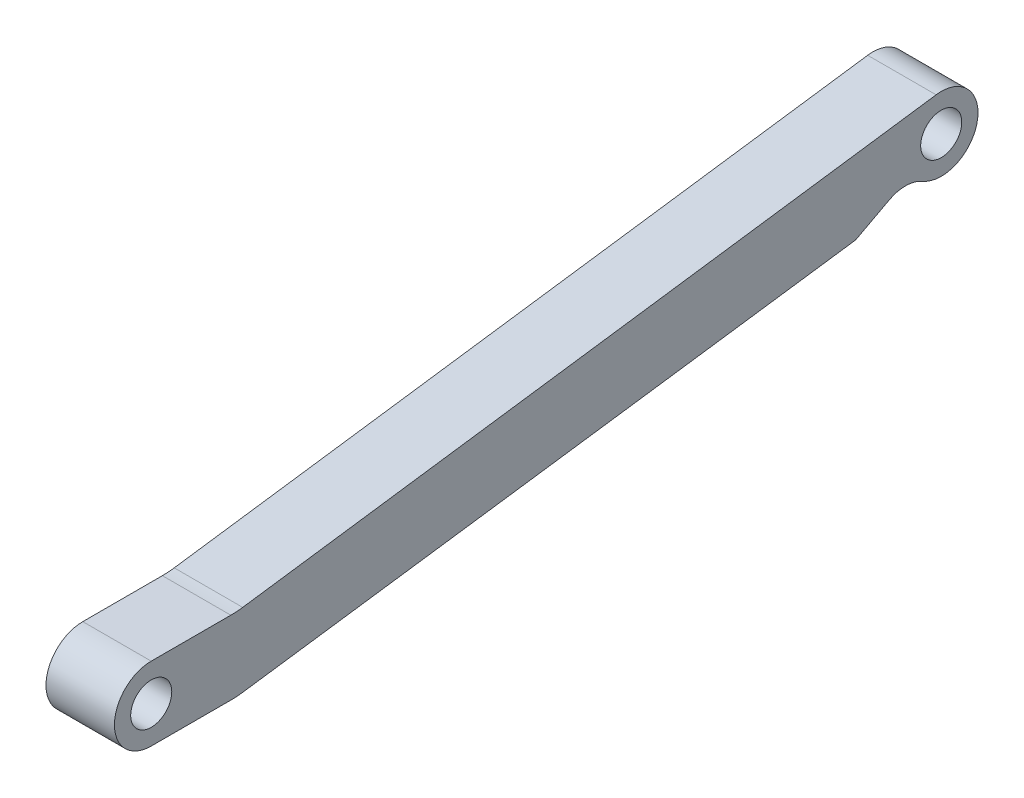
ISO-10303-21;
HEADER;
FILE_DESCRIPTION(('STEP AP214'),'2;1');
FILE_NAME('part.step','',(''),(''),'','','');
FILE_SCHEMA(('AUTOMOTIVE_DESIGN { 1 0 10303 214 1 1 1 1 }'));
ENDSEC;
DATA;
#1=APPLICATION_CONTEXT('core data for automotive mechanical design processes');
#2=APPLICATION_PROTOCOL_DEFINITION('international standard','automotive_design',2000,#1);
#3=PRODUCT_CONTEXT('',#1,'mechanical');
#4=PRODUCT('Part','Part','',(#3));
#5=PRODUCT_RELATED_PRODUCT_CATEGORY('part','',(#4));
#6=PRODUCT_DEFINITION_FORMATION('','',#4);
#7=PRODUCT_DEFINITION_CONTEXT('part definition',#1,'design');
#8=PRODUCT_DEFINITION('design','',#6,#7);
#9=PRODUCT_DEFINITION_SHAPE('','',#8);
#10=(LENGTH_UNIT() NAMED_UNIT(*) SI_UNIT(.MILLI.,.METRE.));
#11=(NAMED_UNIT(*) PLANE_ANGLE_UNIT() SI_UNIT($,.RADIAN.));
#12=(NAMED_UNIT(*) SI_UNIT($,.STERADIAN.) SOLID_ANGLE_UNIT());
#13=UNCERTAINTY_MEASURE_WITH_UNIT(LENGTH_MEASURE(1.E-05),#10,'distance_accuracy_value','');
#14=(GEOMETRIC_REPRESENTATION_CONTEXT(3) GLOBAL_UNCERTAINTY_ASSIGNED_CONTEXT((#13)) GLOBAL_UNIT_ASSIGNED_CONTEXT((#10,
#11,#12)) REPRESENTATION_CONTEXT('',''));
#15=CARTESIAN_POINT('',(0.,0.,0.));
#16=DIRECTION('',(0.,0.,1.));
#17=DIRECTION('',(1.,0.,0.));
#18=AXIS2_PLACEMENT_3D('',#15,#16,#17);
#19=CARTESIAN_POINT('',(-2.,-1.83661344340443,-44.0829449044658));
#20=DIRECTION('',(1.,0.,0.));
#21=DIRECTION('',(0.,0.,-1.));
#22=AXIS2_PLACEMENT_3D('',#19,#20,#21);
#23=CYLINDRICAL_SURFACE('',#22,2.);
#24=DIRECTION('',(1.,0.,0.));
#25=VECTOR('',#24,1.);
#26=CARTESIAN_POINT('',(-2.,-0.108125036944463,-45.0890899381133));
#27=LINE('',#26,#25);
#28=CARTESIAN_POINT('',(-2.,-0.108125036944463,-45.0890899381133));
#29=VERTEX_POINT('',#28);
#30=CARTESIAN_POINT('',(2.,-0.108125036944463,-45.0890899381133));
#31=VERTEX_POINT('',#30);
#32=EDGE_CURVE('E42',#29,#31,#27,.T.);
#33=ORIENTED_EDGE('',*,*,#32,.T.);
#34=CARTESIAN_POINT('',(2.,-1.83661344340443,-44.0829449044658));
#35=DIRECTION('',(1.,0.,0.));
#36=DIRECTION('',(0.,0.,-1.));
#37=AXIS2_PLACEMENT_3D('',#34,#35,#36);
#38=CIRCLE('',#37,2.);
#39=CARTESIAN_POINT('',(2.,-0.0694475118650471,-43.1463956156366));
#40=VERTEX_POINT('',#39);
#41=EDGE_CURVE('E119',#31,#40,#38,.T.);
#42=ORIENTED_EDGE('',*,*,#41,.T.);
#43=DIRECTION('',(1.,0.,0.));
#44=VECTOR('',#43,1.);
#45=CARTESIAN_POINT('',(-2.,-0.0694475118650471,-43.1463956156366));
#46=LINE('',#45,#44);
#47=CARTESIAN_POINT('',(-2.,-0.0694475118650471,-43.1463956156366));
#48=VERTEX_POINT('',#47);
#49=EDGE_CURVE('E11',#48,#40,#46,.T.);
#50=ORIENTED_EDGE('',*,*,#49,.F.);
#51=CARTESIAN_POINT('',(-2.,-1.83661344340443,-44.0829449044658));
#52=DIRECTION('',(1.,0.,0.));
#53=DIRECTION('',(0.,0.,-1.));
#54=AXIS2_PLACEMENT_3D('',#51,#52,#53);
#55=CIRCLE('',#54,2.);
#56=EDGE_CURVE('E55',#29,#48,#55,.T.);
#57=ORIENTED_EDGE('',*,*,#56,.F.);
#58=EDGE_LOOP('',(#33,#42,#50,#57));
#59=FACE_BOUND('',#58,.T.);
#60=ADVANCED_FACE('F39',(#59),#23,.F.);
#61=CARTESIAN_POINT('',(-2.,-17.906450020294,-9.4899254974624));
#62=DIRECTION('',(0.,-0.883582965769693,-0.468274644414615));
#63=DIRECTION('',(0.,0.468274644414615,-0.883582965769693));
#64=AXIS2_PLACEMENT_3D('',#61,#62,#63);
#65=PLANE('',#64);
#66=ORIENTED_EDGE('',*,*,#49,.T.);
#67=DIRECTION('',(0.,0.468274644414615,-0.883582965769693));
#68=VECTOR('',#67,1.);
#69=CARTESIAN_POINT('',(2.,-17.906450020294,-9.4899254974624));
#70=LINE('',#69,#68);
#71=CARTESIAN_POINT('',(2.,-1.11651399164119,-41.1706958492843));
#72=VERTEX_POINT('',#71);
#73=EDGE_CURVE('E137',#72,#40,#70,.T.);
#74=ORIENTED_EDGE('',*,*,#73,.F.);
#75=DIRECTION('',(1.,0.,0.));
#76=VECTOR('',#75,1.);
#77=CARTESIAN_POINT('',(-2.,-1.11651399164119,-41.1706958492843));
#78=LINE('',#77,#76);
#79=CARTESIAN_POINT('',(-2.,-1.11651399164119,-41.1706958492843));
#80=VERTEX_POINT('',#79);
#81=EDGE_CURVE('E47',#80,#72,#78,.T.);
#82=ORIENTED_EDGE('',*,*,#81,.F.);
#83=DIRECTION('',(0.,0.468274644414615,-0.883582965769693));
#84=VECTOR('',#83,1.);
#85=CARTESIAN_POINT('',(-2.,-17.906450020294,-9.4899254974624));
#86=LINE('',#85,#84);
#87=EDGE_CURVE('E185',#80,#48,#86,.T.);
#88=ORIENTED_EDGE('',*,*,#87,.T.);
#89=EDGE_LOOP('',(#66,#74,#82,#88));
#90=FACE_BOUND('',#89,.T.);
#91=ADVANCED_FACE('F234',(#90),#65,.T.);
#92=CARTESIAN_POINT('',(-2.,-6.71574379994448,-0.934557703661422));
#93=DIRECTION('',(0.,-0.990455753784372,-0.137831055264886));
#94=DIRECTION('',(0.,0.137831055264886,-0.990455753784372));
#95=AXIS2_PLACEMENT_3D('',#92,#93,#94);
#96=PLANE('',#95);
#97=ORIENTED_EDGE('',*,*,#81,.T.);
#98=DIRECTION('',(0.,0.137831055264886,-0.990455753784372));
#99=VECTOR('',#98,1.);
#100=CARTESIAN_POINT('',(2.,-6.71574379994448,-0.934557703661422));
#101=LINE('',#100,#99);
#102=CARTESIAN_POINT('',(2.,-6.10227876892186,-5.34292538650434));
#103=VERTEX_POINT('',#102);
#104=EDGE_CURVE('E156',#103,#72,#101,.T.);
#105=ORIENTED_EDGE('',*,*,#104,.F.);
#106=DIRECTION('',(1.,0.,0.));
#107=VECTOR('',#106,1.);
#108=CARTESIAN_POINT('',(-2.,-6.10227876892186,-5.34292538650434));
#109=LINE('',#108,#107);
#110=CARTESIAN_POINT('',(-2.,-6.10227876892186,-5.34292538650434));
#111=VERTEX_POINT('',#110);
#112=EDGE_CURVE('E193',#111,#103,#109,.T.);
#113=ORIENTED_EDGE('',*,*,#112,.F.);
#114=DIRECTION('',(0.,0.137831055264886,-0.990455753784372));
#115=VECTOR('',#114,1.);
#116=CARTESIAN_POINT('',(-2.,-6.71574379994448,-0.934557703661422));
#117=LINE('',#116,#115);
#118=EDGE_CURVE('E183',#111,#80,#117,.T.);
#119=ORIENTED_EDGE('',*,*,#118,.T.);
#120=EDGE_LOOP('',(#97,#105,#113,#119));
#121=FACE_BOUND('',#120,.T.);
#122=ADVANCED_FACE('F232',(#121),#96,.T.);
#123=CARTESIAN_POINT('',(-2.,-1.15,-4.6537701101799));
#124=DIRECTION('',(1.,0.,0.));
#125=DIRECTION('',(0.,0.,-1.));
#126=AXIS2_PLACEMENT_3D('',#123,#124,#125);
#127=CYLINDRICAL_SURFACE('',#126,5.);
#128=ORIENTED_EDGE('',*,*,#112,.T.);
#129=CARTESIAN_POINT('',(2.,-1.15,-4.6537701101799));
#130=DIRECTION('',(1.,0.,0.));
#131=DIRECTION('',(0.,0.,-1.));
#132=AXIS2_PLACEMENT_3D('',#129,#130,#131);
#133=CIRCLE('',#132,5.);
#134=CARTESIAN_POINT('',(2.,-6.15,-4.6537701101799));
#135=VERTEX_POINT('',#134);
#136=EDGE_CURVE('E153',#135,#103,#133,.T.);
#137=ORIENTED_EDGE('',*,*,#136,.F.);
#138=DIRECTION('',(1.,0.,0.));
#139=VECTOR('',#138,1.);
#140=CARTESIAN_POINT('',(-2.,-6.15,-4.6537701101799));
#141=LINE('',#140,#139);
#142=CARTESIAN_POINT('',(-2.,-6.15,-4.6537701101799));
#143=VERTEX_POINT('',#142);
#144=EDGE_CURVE('E195',#143,#135,#141,.T.);
#145=ORIENTED_EDGE('',*,*,#144,.F.);
#146=CARTESIAN_POINT('',(-2.,-1.15,-4.6537701101799));
#147=DIRECTION('',(1.,0.,0.));
#148=DIRECTION('',(0.,0.,-1.));
#149=AXIS2_PLACEMENT_3D('',#146,#147,#148);
#150=CIRCLE('',#149,5.);
#151=EDGE_CURVE('E180',#143,#111,#150,.T.);
#152=ORIENTED_EDGE('',*,*,#151,.T.);
#153=EDGE_LOOP('',(#128,#137,#145,#152));
#154=FACE_BOUND('',#153,.T.);
#155=ADVANCED_FACE('F227',(#154),#127,.T.);
#156=CARTESIAN_POINT('',(-2.,-6.15,0.));
#157=DIRECTION('',(0.,-1.,0.));
#158=DIRECTION('',(0.,0.,-1.));
#159=AXIS2_PLACEMENT_3D('',#156,#157,#158);
#160=PLANE('',#159);
#161=ORIENTED_EDGE('',*,*,#144,.T.);
#162=DIRECTION('',(0.,0.,-1.));
#163=VECTOR('',#162,1.);
#164=CARTESIAN_POINT('',(2.,-6.15,0.));
#165=LINE('',#164,#163);
#166=CARTESIAN_POINT('',(2.,-6.15,0.));
#167=VERTEX_POINT('',#166);
#168=EDGE_CURVE('E150',#167,#135,#165,.T.);
#169=ORIENTED_EDGE('',*,*,#168,.F.);
#170=DIRECTION('',(1.,0.,0.));
#171=VECTOR('',#170,1.);
#172=CARTESIAN_POINT('',(-2.,-6.15,0.));
#173=LINE('',#172,#171);
#174=CARTESIAN_POINT('',(-2.,-6.15,0.));
#175=VERTEX_POINT('',#174);
#176=EDGE_CURVE('E197',#175,#167,#173,.T.);
#177=ORIENTED_EDGE('',*,*,#176,.F.);
#178=DIRECTION('',(0.,0.,-1.));
#179=VECTOR('',#178,1.);
#180=CARTESIAN_POINT('',(-2.,-6.15,0.));
#181=LINE('',#180,#179);
#182=EDGE_CURVE('E177',#175,#143,#181,.T.);
#183=ORIENTED_EDGE('',*,*,#182,.T.);
#184=EDGE_LOOP('',(#161,#169,#177,#183));
#185=FACE_BOUND('',#184,.T.);
#186=ADVANCED_FACE('F223',(#185),#160,.T.);
#187=CARTESIAN_POINT('',(-2.,-4.,0.));
#188=DIRECTION('',(1.,0.,0.));
#189=DIRECTION('',(0.,0.,-1.));
#190=AXIS2_PLACEMENT_3D('',#187,#188,#189);
#191=CYLINDRICAL_SURFACE('',#190,2.15);
#192=ORIENTED_EDGE('',*,*,#176,.T.);
#193=CARTESIAN_POINT('',(2.,-4.,0.));
#194=DIRECTION('',(1.,0.,0.));
#195=DIRECTION('',(0.,0.,-1.));
#196=AXIS2_PLACEMENT_3D('',#193,#194,#195);
#197=CIRCLE('',#196,2.15);
#198=CARTESIAN_POINT('',(2.,-1.85,0.));
#199=VERTEX_POINT('',#198);
#200=EDGE_CURVE('E147',#199,#167,#197,.T.);
#201=ORIENTED_EDGE('',*,*,#200,.F.);
#202=DIRECTION('',(1.,0.,0.));
#203=VECTOR('',#202,1.);
#204=CARTESIAN_POINT('',(-2.,-1.85,0.));
#205=LINE('',#204,#203);
#206=CARTESIAN_POINT('',(-2.,-1.85,0.));
#207=VERTEX_POINT('',#206);
#208=EDGE_CURVE('E199',#207,#199,#205,.T.);
#209=ORIENTED_EDGE('',*,*,#208,.F.);
#210=CARTESIAN_POINT('',(-2.,-4.,0.));
#211=DIRECTION('',(1.,0.,0.));
#212=DIRECTION('',(0.,0.,-1.));
#213=AXIS2_PLACEMENT_3D('',#210,#211,#212);
#214=CIRCLE('',#213,2.15);
#215=EDGE_CURVE('E174',#207,#175,#214,.T.);
#216=ORIENTED_EDGE('',*,*,#215,.T.);
#217=EDGE_LOOP('',(#192,#201,#209,#216));
#218=FACE_BOUND('',#217,.T.);
#219=ADVANCED_FACE('F250',(#218),#191,.T.);
#220=CARTESIAN_POINT('',(-2.,-1.85,0.));
#221=DIRECTION('',(0.,-1.,0.));
#222=DIRECTION('',(0.,0.,-1.));
#223=AXIS2_PLACEMENT_3D('',#220,#221,#222);
#224=PLANE('',#223);
#225=ORIENTED_EDGE('',*,*,#208,.T.);
#226=DIRECTION('',(0.,0.,-1.));
#227=VECTOR('',#226,1.);
#228=CARTESIAN_POINT('',(2.,-1.85,0.));
#229=LINE('',#228,#227);
#230=CARTESIAN_POINT('',(2.,-1.85,-4.65127219501765));
#231=VERTEX_POINT('',#230);
#232=EDGE_CURVE('E144',#199,#231,#229,.T.);
#233=ORIENTED_EDGE('',*,*,#232,.T.);
#234=DIRECTION('',(1.,0.,0.));
#235=VECTOR('',#234,1.);
#236=CARTESIAN_POINT('',(-2.,-1.85,-4.65127219501765));
#237=LINE('',#236,#235);
#238=CARTESIAN_POINT('',(-2.,-1.85,-4.65127219501765));
#239=VERTEX_POINT('',#238);
#240=EDGE_CURVE('E201',#239,#231,#237,.T.);
#241=ORIENTED_EDGE('',*,*,#240,.F.);
#242=DIRECTION('',(0.,0.,-1.));
#243=VECTOR('',#242,1.);
#244=CARTESIAN_POINT('',(-2.,-1.85,0.));
#245=LINE('',#244,#243);
#246=EDGE_CURVE('E172',#207,#239,#245,.T.);
#247=ORIENTED_EDGE('',*,*,#246,.F.);
#248=EDGE_LOOP('',(#225,#233,#241,#247));
#249=FACE_BOUND('',#248,.T.);
#250=ADVANCED_FACE('F216',(#249),#224,.F.);
#251=CARTESIAN_POINT('',(-2.,3.15,-4.65127219501765));
#252=DIRECTION('',(1.,0.,0.));
#253=DIRECTION('',(0.,0.,-1.));
#254=AXIS2_PLACEMENT_3D('',#251,#252,#253);
#255=CYLINDRICAL_SURFACE('',#254,5.);
#256=ORIENTED_EDGE('',*,*,#240,.T.);
#257=CARTESIAN_POINT('',(2.,3.15,-4.65127219501765));
#258=DIRECTION('',(1.,0.,0.));
#259=DIRECTION('',(0.,0.,-1.));
#260=AXIS2_PLACEMENT_3D('',#257,#258,#259);
#261=CIRCLE('',#260,5.);
#262=CARTESIAN_POINT('',(2.,-1.80159104980529,-5.34535149559367));
#263=VERTEX_POINT('',#262);
#264=EDGE_CURVE('E141',#231,#263,#261,.T.);
#265=ORIENTED_EDGE('',*,*,#264,.T.);
#266=DIRECTION('',(1.,0.,0.));
#267=VECTOR('',#266,1.);
#268=CARTESIAN_POINT('',(-2.,-1.80159104980529,-5.34535149559367));
#269=LINE('',#268,#267);
#270=CARTESIAN_POINT('',(-2.,-1.80159104980529,-5.34535149559367));
#271=VERTEX_POINT('',#270);
#272=EDGE_CURVE('E203',#271,#263,#269,.T.);
#273=ORIENTED_EDGE('',*,*,#272,.F.);
#274=CARTESIAN_POINT('',(-2.,3.15,-4.65127219501765));
#275=DIRECTION('',(1.,0.,0.));
#276=DIRECTION('',(0.,0.,-1.));
#277=AXIS2_PLACEMENT_3D('',#274,#275,#276);
#278=CIRCLE('',#277,5.);
#279=EDGE_CURVE('E170',#239,#271,#278,.T.);
#280=ORIENTED_EDGE('',*,*,#279,.F.);
#281=EDGE_LOOP('',(#256,#265,#273,#280));
#282=FACE_BOUND('',#281,.T.);
#283=ADVANCED_FACE('F212',(#282),#255,.F.);
#284=CARTESIAN_POINT('',(-2.,-2.50171016093133,-0.350672182189077));
#285=DIRECTION('',(0.,-0.990318209961059,-0.138815860115203));
#286=DIRECTION('',(0.,0.138815860115203,-0.990318209961059));
#287=AXIS2_PLACEMENT_3D('',#284,#285,#286);
#288=PLANE('',#287);
#289=ORIENTED_EDGE('',*,*,#272,.T.);
#290=DIRECTION('',(0.,0.138815860115203,-0.990318209961059));
#291=VECTOR('',#290,1.);
#292=CARTESIAN_POINT('',(2.,-2.50171016093133,-0.350672182189077));
#293=LINE('',#292,#291);
#294=CARTESIAN_POINT('',(2.,3.87918415141628,-45.8722417500366));
#295=VERTEX_POINT('',#294);
#296=EDGE_CURVE('E131',#263,#295,#293,.T.);
#297=ORIENTED_EDGE('',*,*,#296,.T.);
#298=DIRECTION('',(1.,0.,0.));
#299=VECTOR('',#298,1.);
#300=CARTESIAN_POINT('',(-2.,3.87918415141628,-45.8722417500366));
#301=LINE('',#300,#299);
#302=CARTESIAN_POINT('',(-2.,3.87918415141628,-45.8722417500366));
#303=VERTEX_POINT('',#302);
#304=EDGE_CURVE('E122',#303,#295,#301,.T.);
#305=ORIENTED_EDGE('',*,*,#304,.F.);
#306=DIRECTION('',(0.,0.138815860115203,-0.990318209961059));
#307=VECTOR('',#306,1.);
#308=CARTESIAN_POINT('',(-2.,-2.50171016093133,-0.350672182189077));
#309=LINE('',#308,#307);
#310=EDGE_CURVE('E168',#271,#303,#309,.T.);
#311=ORIENTED_EDGE('',*,*,#310,.F.);
#312=EDGE_LOOP('',(#289,#297,#305,#311));
#313=FACE_BOUND('',#312,.T.);
#314=ADVANCED_FACE('F207',(#313),#288,.F.);
#315=CARTESIAN_POINT('',(-2.,-4.,0.));
#316=DIRECTION('',(1.,0.,0.));
#317=DIRECTION('',(0.,0.,-1.));
#318=AXIS2_PLACEMENT_3D('',#315,#316,#317);
#319=CYLINDRICAL_SURFACE('',#318,1.2);
#320=CARTESIAN_POINT('',(-2.,-4.,0.));
#321=DIRECTION('',(1.,0.,0.));
#322=DIRECTION('',(0.,0.,-1.));
#323=AXIS2_PLACEMENT_3D('',#320,#321,#322);
#324=CIRCLE('',#323,1.2);
#325=CARTESIAN_POINT('',(-2.,-4.,-1.19999999999995));
#326=VERTEX_POINT('',#325);
#327=EDGE_CURVE('E187',#326,#326,#324,.T.);
#328=ORIENTED_EDGE('',*,*,#327,.F.);
#329=EDGE_LOOP('',(#328));
#330=FACE_BOUND('',#329,.T.);
#331=CARTESIAN_POINT('',(2.,-4.,0.));
#332=DIRECTION('',(1.,0.,0.));
#333=DIRECTION('',(0.,0.,-1.));
#334=AXIS2_PLACEMENT_3D('',#331,#332,#333);
#335=CIRCLE('',#334,1.2);
#336=CARTESIAN_POINT('',(2.,-4.,-1.19999999999995));
#337=VERTEX_POINT('',#336);
#338=EDGE_CURVE('E159',#337,#337,#335,.T.);
#339=ORIENTED_EDGE('',*,*,#338,.T.);
#340=EDGE_LOOP('',(#339));
#341=FACE_BOUND('',#340,.T.);
#342=ADVANCED_FACE('F243',(#330,#341),#319,.F.);
#343=CARTESIAN_POINT('',(-2.,1.75,-46.1706958492843));
#344=DIRECTION('',(1.,0.,0.));
#345=DIRECTION('',(0.,0.,-1.));
#346=AXIS2_PLACEMENT_3D('',#343,#344,#345);
#347=CYLINDRICAL_SURFACE('',#346,2.15);
#348=ORIENTED_EDGE('',*,*,#304,.T.);
#349=CARTESIAN_POINT('',(2.,1.75,-46.1706958492843));
#350=DIRECTION('',(1.,0.,0.));
#351=DIRECTION('',(0.,0.,-1.));
#352=AXIS2_PLACEMENT_3D('',#349,#350,#351);
#353=CIRCLE('',#352,2.15);
#354=EDGE_CURVE('E125',#31,#295,#353,.T.);
#355=ORIENTED_EDGE('',*,*,#354,.F.);
#356=ORIENTED_EDGE('',*,*,#32,.F.);
#357=CARTESIAN_POINT('',(-2.,1.75,-46.1706958492843));
#358=DIRECTION('',(1.,0.,0.));
#359=DIRECTION('',(0.,0.,-1.));
#360=AXIS2_PLACEMENT_3D('',#357,#358,#359);
#361=CIRCLE('',#360,2.15);
#362=EDGE_CURVE('E166',#29,#303,#361,.T.);
#363=ORIENTED_EDGE('',*,*,#362,.T.);
#364=EDGE_LOOP('',(#348,#355,#356,#363));
#365=FACE_BOUND('',#364,.T.);
#366=ADVANCED_FACE('F126',(#365),#347,.T.);
#367=CARTESIAN_POINT('',(-2.,1.75,-46.1706958492843));
#368=DIRECTION('',(1.,0.,0.));
#369=DIRECTION('',(0.,0.,-1.));
#370=AXIS2_PLACEMENT_3D('',#367,#368,#369);
#371=CYLINDRICAL_SURFACE('',#370,1.2);
#372=CARTESIAN_POINT('',(-2.,1.75,-46.1706958492843));
#373=DIRECTION('',(1.,0.,0.));
#374=DIRECTION('',(0.,0.,-1.));
#375=AXIS2_PLACEMENT_3D('',#372,#373,#374);
#376=CIRCLE('',#375,1.2);
#377=CARTESIAN_POINT('',(-2.,1.75,-47.3706958492843));
#378=VERTEX_POINT('',#377);
#379=EDGE_CURVE('E123',#378,#378,#376,.T.);
#380=ORIENTED_EDGE('',*,*,#379,.F.);
#381=EDGE_LOOP('',(#380));
#382=FACE_BOUND('',#381,.T.);
#383=CARTESIAN_POINT('',(2.,1.75,-46.1706958492843));
#384=DIRECTION('',(1.,0.,0.));
#385=DIRECTION('',(0.,0.,-1.));
#386=AXIS2_PLACEMENT_3D('',#383,#384,#385);
#387=CIRCLE('',#386,1.2);
#388=CARTESIAN_POINT('',(2.,1.75,-47.3706958492843));
#389=VERTEX_POINT('',#388);
#390=EDGE_CURVE('E162',#389,#389,#387,.T.);
#391=ORIENTED_EDGE('',*,*,#390,.T.);
#392=EDGE_LOOP('',(#391));
#393=FACE_BOUND('',#392,.T.);
#394=ADVANCED_FACE('F259',(#382,#393),#371,.F.);
#395=CARTESIAN_POINT('',(-2.,0.,0.));
#396=DIRECTION('',(1.,0.,0.));
#397=DIRECTION('',(0.,0.,-1.));
#398=AXIS2_PLACEMENT_3D('',#395,#396,#397);
#399=PLANE('',#398);
#400=ORIENTED_EDGE('',*,*,#56,.T.);
#401=ORIENTED_EDGE('',*,*,#87,.F.);
#402=ORIENTED_EDGE('',*,*,#118,.F.);
#403=ORIENTED_EDGE('',*,*,#151,.F.);
#404=ORIENTED_EDGE('',*,*,#182,.F.);
#405=ORIENTED_EDGE('',*,*,#215,.F.);
#406=ORIENTED_EDGE('',*,*,#246,.T.);
#407=ORIENTED_EDGE('',*,*,#279,.T.);
#408=ORIENTED_EDGE('',*,*,#310,.T.);
#409=ORIENTED_EDGE('',*,*,#362,.F.);
#410=EDGE_LOOP('',(#400,#401,#402,#403,#404,#405,#406,#407,#408,#409));
#411=FACE_BOUND('',#410,.T.);
#412=ORIENTED_EDGE('',*,*,#327,.T.);
#413=EDGE_LOOP('',(#412));
#414=FACE_BOUND('',#413,.T.);
#415=ORIENTED_EDGE('',*,*,#379,.T.);
#416=EDGE_LOOP('',(#415));
#417=FACE_BOUND('',#416,.T.);
#418=ADVANCED_FACE('F229',(#411,#414,#417),#399,.F.);
#419=CARTESIAN_POINT('',(2.,0.,0.));
#420=DIRECTION('',(1.,0.,0.));
#421=DIRECTION('',(0.,0.,-1.));
#422=AXIS2_PLACEMENT_3D('',#419,#420,#421);
#423=PLANE('',#422);
#424=ORIENTED_EDGE('',*,*,#41,.F.);
#425=ORIENTED_EDGE('',*,*,#354,.T.);
#426=ORIENTED_EDGE('',*,*,#296,.F.);
#427=ORIENTED_EDGE('',*,*,#264,.F.);
#428=ORIENTED_EDGE('',*,*,#232,.F.);
#429=ORIENTED_EDGE('',*,*,#200,.T.);
#430=ORIENTED_EDGE('',*,*,#168,.T.);
#431=ORIENTED_EDGE('',*,*,#136,.T.);
#432=ORIENTED_EDGE('',*,*,#104,.T.);
#433=ORIENTED_EDGE('',*,*,#73,.T.);
#434=EDGE_LOOP('',(#424,#425,#426,#427,#428,#429,#430,#431,#432,#433));
#435=FACE_BOUND('',#434,.T.);
#436=ORIENTED_EDGE('',*,*,#338,.F.);
#437=EDGE_LOOP('',(#436));
#438=FACE_BOUND('',#437,.T.);
#439=ORIENTED_EDGE('',*,*,#390,.F.);
#440=EDGE_LOOP('',(#439));
#441=FACE_BOUND('',#440,.T.);
#442=ADVANCED_FACE('F134',(#435,#438,#441),#423,.T.);
#443=CLOSED_SHELL('',(#60,#91,#122,#155,#186,#219,#250,#283,#314,#342,#366,#394,#418,#442));
#444=MANIFOLD_SOLID_BREP('B2',#443);
#445=ADVANCED_BREP_SHAPE_REPRESENTATION('',(#18,#444),#14);
#446=SHAPE_DEFINITION_REPRESENTATION(#9,#445);
ENDSEC;
END-ISO-10303-21;
